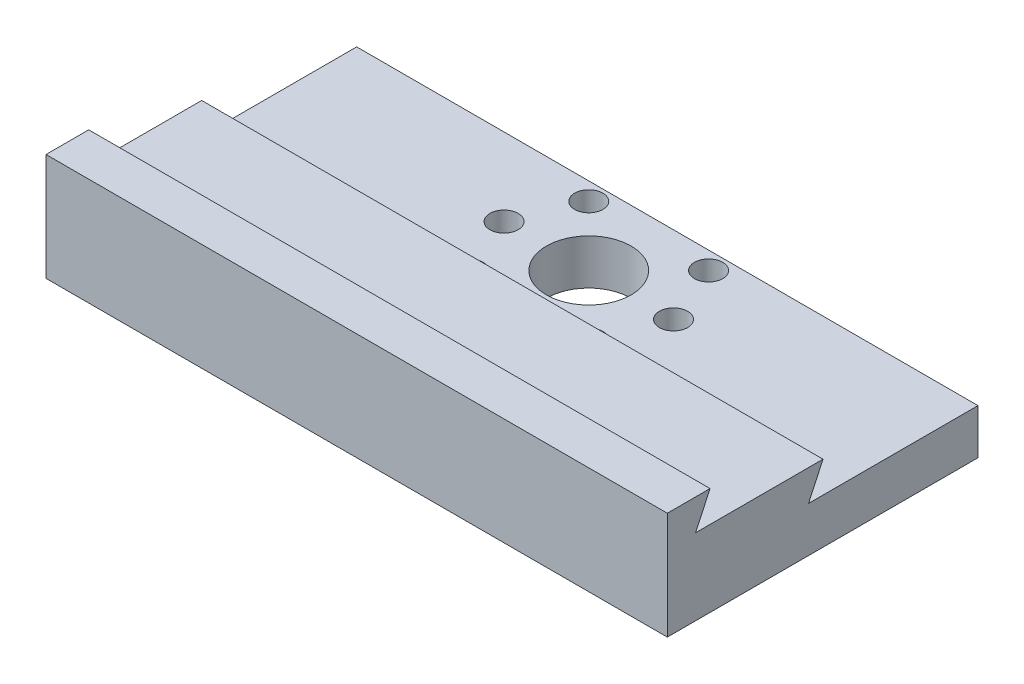
ISO-10303-21;
HEADER;
FILE_DESCRIPTION(('STEP AP214'),'2;1');
FILE_NAME('part.step','',(''),(''),'','','');
FILE_SCHEMA(('AUTOMOTIVE_DESIGN { 1 0 10303 214 1 1 1 1 }'));
ENDSEC;
DATA;
#1=APPLICATION_CONTEXT('core data for automotive mechanical design processes');
#2=APPLICATION_PROTOCOL_DEFINITION('international standard','automotive_design',2000,#1);
#3=PRODUCT_CONTEXT('',#1,'mechanical');
#4=PRODUCT('Part','Part','',(#3));
#5=PRODUCT_RELATED_PRODUCT_CATEGORY('part','',(#4));
#6=PRODUCT_DEFINITION_FORMATION('','',#4);
#7=PRODUCT_DEFINITION_CONTEXT('part definition',#1,'design');
#8=PRODUCT_DEFINITION('design','',#6,#7);
#9=PRODUCT_DEFINITION_SHAPE('','',#8);
#10=(LENGTH_UNIT() NAMED_UNIT(*) SI_UNIT(.MILLI.,.METRE.));
#11=(NAMED_UNIT(*) PLANE_ANGLE_UNIT() SI_UNIT($,.RADIAN.));
#12=(NAMED_UNIT(*) SI_UNIT($,.STERADIAN.) SOLID_ANGLE_UNIT());
#13=UNCERTAINTY_MEASURE_WITH_UNIT(LENGTH_MEASURE(1.E-05),#10,'distance_accuracy_value','');
#14=(GEOMETRIC_REPRESENTATION_CONTEXT(3) GLOBAL_UNCERTAINTY_ASSIGNED_CONTEXT((#13)) GLOBAL_UNIT_ASSIGNED_CONTEXT((#10,
#11,#12)) REPRESENTATION_CONTEXT('',''));
#15=CARTESIAN_POINT('',(0.,0.,0.));
#16=DIRECTION('',(0.,0.,1.));
#17=DIRECTION('',(1.,0.,0.));
#18=AXIS2_PLACEMENT_3D('',#15,#16,#17);
#19=CARTESIAN_POINT('',(110.,0.,-55.));
#20=DIRECTION('',(0.,1.,0.));
#21=DIRECTION('',(0.,0.,1.));
#22=AXIS2_PLACEMENT_3D('',#19,#20,#21);
#23=PLANE('',#22);
#24=CARTESIAN_POINT('',(44.2229672298513,0.,-51.8668942977481));
#25=DIRECTION('',(0.,1.,0.));
#26=DIRECTION('',(0.,0.,1.));
#27=AXIS2_PLACEMENT_3D('',#24,#25,#26);
#28=CIRCLE('',#27,2.50495838378975);
#29=CARTESIAN_POINT('',(44.2229672298513,0.,-49.3619359139584));
#30=VERTEX_POINT('',#29);
#31=EDGE_CURVE('E210',#30,#30,#28,.T.);
#32=ORIENTED_EDGE('',*,*,#31,.T.);
#33=EDGE_LOOP('',(#32));
#34=FACE_BOUND('',#33,.T.);
#35=CARTESIAN_POINT('',(65.4361706654477,0.,-51.8668942977483));
#36=DIRECTION('',(0.,1.,0.));
#37=DIRECTION('',(0.,0.,1.));
#38=AXIS2_PLACEMENT_3D('',#35,#36,#37);
#39=CIRCLE('',#38,2.50495838378975);
#40=CARTESIAN_POINT('',(65.4361706654477,0.,-49.3619359139586));
#41=VERTEX_POINT('',#40);
#42=EDGE_CURVE('E213',#41,#41,#39,.T.);
#43=ORIENTED_EDGE('',*,*,#42,.T.);
#44=EDGE_LOOP('',(#43));
#45=FACE_BOUND('',#44,.T.);
#46=CARTESIAN_POINT('',(69.8295689476496,0.,-41.26029257995));
#47=DIRECTION('',(0.,1.,0.));
#48=DIRECTION('',(0.,0.,1.));
#49=AXIS2_PLACEMENT_3D('',#46,#47,#48);
#50=CIRCLE('',#49,2.50495838378975);
#51=CARTESIAN_POINT('',(69.8295689476496,0.,-38.7553341961603));
#52=VERTEX_POINT('',#51);
#53=EDGE_CURVE('E216',#52,#52,#50,.T.);
#54=ORIENTED_EDGE('',*,*,#53,.T.);
#55=EDGE_LOOP('',(#54));
#56=FACE_BOUND('',#55,.T.);
#57=CARTESIAN_POINT('',(65.4361706654479,0.,-30.6536908621519));
#58=DIRECTION('',(0.,1.,0.));
#59=DIRECTION('',(0.,0.,1.));
#60=AXIS2_PLACEMENT_3D('',#57,#58,#59);
#61=CIRCLE('',#60,2.50495838378975);
#62=CARTESIAN_POINT('',(65.4361706654479,0.,-28.1487324783621));
#63=VERTEX_POINT('',#62);
#64=EDGE_CURVE('E219',#63,#63,#61,.T.);
#65=ORIENTED_EDGE('',*,*,#64,.T.);
#66=EDGE_LOOP('',(#65));
#67=FACE_BOUND('',#66,.T.);
#68=CARTESIAN_POINT('',(44.2229672298514,0.,-30.6536908621518));
#69=DIRECTION('',(0.,1.,0.));
#70=DIRECTION('',(0.,0.,1.));
#71=AXIS2_PLACEMENT_3D('',#68,#69,#70);
#72=CIRCLE('',#71,2.50495838378975);
#73=CARTESIAN_POINT('',(44.2229672298514,0.,-28.1487324783621));
#74=VERTEX_POINT('',#73);
#75=EDGE_CURVE('E222',#74,#74,#72,.T.);
#76=ORIENTED_EDGE('',*,*,#75,.T.);
#77=EDGE_LOOP('',(#76));
#78=FACE_BOUND('',#77,.T.);
#79=CARTESIAN_POINT('',(39.8295689476496,0.,-41.26029257995));
#80=DIRECTION('',(0.,1.,0.));
#81=DIRECTION('',(0.,0.,1.));
#82=AXIS2_PLACEMENT_3D('',#79,#80,#81);
#83=CIRCLE('',#82,2.50495838378975);
#84=CARTESIAN_POINT('',(39.8295689476496,0.,-38.7553341961603));
#85=VERTEX_POINT('',#84);
#86=EDGE_CURVE('E204',#85,#85,#83,.T.);
#87=ORIENTED_EDGE('',*,*,#86,.T.);
#88=EDGE_LOOP('',(#87));
#89=FACE_BOUND('',#88,.T.);
#90=CARTESIAN_POINT('',(54.8295689476496,0.,-41.26029257995));
#91=DIRECTION('',(0.,1.,0.));
#92=DIRECTION('',(0.,0.,1.));
#93=AXIS2_PLACEMENT_3D('',#90,#91,#92);
#94=CIRCLE('',#93,7.5);
#95=CARTESIAN_POINT('',(54.8295689476496,0.,-33.76029257995));
#96=VERTEX_POINT('',#95);
#97=EDGE_CURVE('E191',#96,#96,#94,.T.);
#98=ORIENTED_EDGE('',*,*,#97,.T.);
#99=EDGE_LOOP('',(#98));
#100=FACE_BOUND('',#99,.T.);
#101=DIRECTION('',(0.,0.,-1.));
#102=VECTOR('',#101,1.);
#103=CARTESIAN_POINT('',(0.,0.,-55.));
#104=LINE('',#103,#102);
#105=CARTESIAN_POINT('',(0.,0.,0.));
#106=VERTEX_POINT('',#105);
#107=CARTESIAN_POINT('',(0.,0.,-55.));
#108=VERTEX_POINT('',#107);
#109=EDGE_CURVE('E139',#106,#108,#104,.T.);
#110=ORIENTED_EDGE('',*,*,#109,.T.);
#111=DIRECTION('',(-1.,0.,0.));
#112=VECTOR('',#111,1.);
#113=CARTESIAN_POINT('',(110.,0.,-55.));
#114=LINE('',#113,#112);
#115=CARTESIAN_POINT('',(110.,0.,-55.));
#116=VERTEX_POINT('',#115);
#117=EDGE_CURVE('E11',#116,#108,#114,.T.);
#118=ORIENTED_EDGE('',*,*,#117,.F.);
#119=DIRECTION('',(0.,0.,-1.));
#120=VECTOR('',#119,1.);
#121=CARTESIAN_POINT('',(110.,0.,-55.));
#122=LINE('',#121,#120);
#123=CARTESIAN_POINT('',(110.,0.,0.));
#124=VERTEX_POINT('',#123);
#125=EDGE_CURVE('E154',#124,#116,#122,.T.);
#126=ORIENTED_EDGE('',*,*,#125,.F.);
#127=DIRECTION('',(-1.,0.,0.));
#128=VECTOR('',#127,1.);
#129=CARTESIAN_POINT('',(110.,0.,0.));
#130=LINE('',#129,#128);
#131=EDGE_CURVE('E135',#124,#106,#130,.T.);
#132=ORIENTED_EDGE('',*,*,#131,.T.);
#133=EDGE_LOOP('',(#110,#118,#126,#132));
#134=FACE_BOUND('',#133,.T.);
#135=ADVANCED_FACE('F43',(#34,#45,#56,#67,#78,#89,#100,#134),#23,.F.);
#136=CARTESIAN_POINT('',(110.,8.00000000000002,-55.));
#137=DIRECTION('',(0.,0.,1.));
#138=DIRECTION('',(1.,0.,0.));
#139=AXIS2_PLACEMENT_3D('',#136,#137,#138);
#140=PLANE('',#139);
#141=CARTESIAN_POINT('',(20.9488303410143,4.50000000000001,-55.));
#142=DIRECTION('',(0.,0.,-1.));
#143=DIRECTION('',(-1.,0.,0.));
#144=AXIS2_PLACEMENT_3D('',#141,#142,#143);
#145=CIRCLE('',#144,2.);
#146=CARTESIAN_POINT('',(18.9488303410143,4.50000000000001,-55.));
#147=VERTEX_POINT('',#146);
#148=EDGE_CURVE('E194',#147,#147,#145,.T.);
#149=ORIENTED_EDGE('',*,*,#148,.F.);
#150=EDGE_LOOP('',(#149));
#151=FACE_BOUND('',#150,.T.);
#152=CARTESIAN_POINT('',(89.0511696589857,4.50000000000001,-55.));
#153=DIRECTION('',(0.,0.,-1.));
#154=DIRECTION('',(1.,0.,0.));
#155=AXIS2_PLACEMENT_3D('',#152,#153,#154);
#156=CIRCLE('',#155,2.);
#157=CARTESIAN_POINT('',(91.0511696589857,4.50000000000001,-55.));
#158=VERTEX_POINT('',#157);
#159=EDGE_CURVE('E187',#158,#158,#156,.T.);
#160=ORIENTED_EDGE('',*,*,#159,.F.);
#161=EDGE_LOOP('',(#160));
#162=FACE_BOUND('',#161,.T.);
#163=DIRECTION('',(0.,1.,0.));
#164=VECTOR('',#163,1.);
#165=CARTESIAN_POINT('',(0.,8.00000000000002,-55.));
#166=LINE('',#165,#164);
#167=CARTESIAN_POINT('',(0.,8.00000000000002,-55.));
#168=VERTEX_POINT('',#167);
#169=EDGE_CURVE('E142',#108,#168,#166,.T.);
#170=ORIENTED_EDGE('',*,*,#169,.T.);
#171=DIRECTION('',(-1.,0.,0.));
#172=VECTOR('',#171,1.);
#173=CARTESIAN_POINT('',(110.,8.00000000000002,-55.));
#174=LINE('',#173,#172);
#175=CARTESIAN_POINT('',(110.,8.00000000000002,-55.));
#176=VERTEX_POINT('',#175);
#177=EDGE_CURVE('E51',#176,#168,#174,.T.);
#178=ORIENTED_EDGE('',*,*,#177,.F.);
#179=DIRECTION('',(0.,1.,0.));
#180=VECTOR('',#179,1.);
#181=CARTESIAN_POINT('',(110.,8.00000000000002,-55.));
#182=LINE('',#181,#180);
#183=EDGE_CURVE('E102',#116,#176,#182,.T.);
#184=ORIENTED_EDGE('',*,*,#183,.F.);
#185=ORIENTED_EDGE('',*,*,#117,.T.);
#186=EDGE_LOOP('',(#170,#178,#184,#185));
#187=FACE_BOUND('',#186,.T.);
#188=ADVANCED_FACE('F246',(#151,#162,#187),#140,.F.);
#189=CARTESIAN_POINT('',(110.,8.00000000000001,-25.));
#190=DIRECTION('',(0.,-1.,0.));
#191=DIRECTION('',(0.,0.,-1.));
#192=AXIS2_PLACEMENT_3D('',#189,#190,#191);
#193=PLANE('',#192);
#194=CARTESIAN_POINT('',(44.2229672298513,8.00000000000001,-51.8668942977481));
#195=DIRECTION('',(0.,1.,0.));
#196=DIRECTION('',(-0.707106781186539,0.,0.707106781186556));
#197=AXIS2_PLACEMENT_3D('',#194,#195,#196);
#198=CIRCLE('',#197,2.50495838378975);
#199=CARTESIAN_POINT('',(42.4516941700835,8.00000000000001,-50.0956212379803));
#200=VERTEX_POINT('',#199);
#201=EDGE_CURVE('E229',#200,#200,#198,.T.);
#202=ORIENTED_EDGE('',*,*,#201,.F.);
#203=EDGE_LOOP('',(#202));
#204=FACE_BOUND('',#203,.T.);
#205=CARTESIAN_POINT('',(65.4361706654477,8.00000000000001,-51.8668942977483));
#206=DIRECTION('',(0.,1.,0.));
#207=DIRECTION('',(-0.707106781186554,0.,-0.707106781186541));
#208=AXIS2_PLACEMENT_3D('',#205,#206,#207);
#209=CIRCLE('',#208,2.50495838378975);
#210=CARTESIAN_POINT('',(63.6648976056799,8.00000000000001,-53.6381673575161));
#211=VERTEX_POINT('',#210);
#212=EDGE_CURVE('E232',#211,#211,#209,.T.);
#213=ORIENTED_EDGE('',*,*,#212,.F.);
#214=EDGE_LOOP('',(#213));
#215=FACE_BOUND('',#214,.T.);
#216=CARTESIAN_POINT('',(69.8295689476496,8.00000000000001,-41.26029257995));
#217=DIRECTION('',(0.,1.,0.));
#218=DIRECTION('',(0.,0.,-1.));
#219=AXIS2_PLACEMENT_3D('',#216,#217,#218);
#220=CIRCLE('',#219,2.50495838378975);
#221=CARTESIAN_POINT('',(69.8295689476496,8.00000000000001,-43.7652509637398));
#222=VERTEX_POINT('',#221);
#223=EDGE_CURVE('E235',#222,#222,#220,.T.);
#224=ORIENTED_EDGE('',*,*,#223,.F.);
#225=EDGE_LOOP('',(#224));
#226=FACE_BOUND('',#225,.T.);
#227=CARTESIAN_POINT('',(65.4361706654479,8.00000000000001,-30.6536908621519));
#228=DIRECTION('',(0.,1.,0.));
#229=DIRECTION('',(0.707106781186544,0.,-0.707106781186551));
#230=AXIS2_PLACEMENT_3D('',#227,#228,#229);
#231=CIRCLE('',#230,2.50495838378975);
#232=CARTESIAN_POINT('',(67.2074437252157,8.00000000000001,-32.4249639219197));
#233=VERTEX_POINT('',#232);
#234=EDGE_CURVE('E228',#233,#233,#231,.T.);
#235=ORIENTED_EDGE('',*,*,#234,.F.);
#236=EDGE_LOOP('',(#235));
#237=FACE_BOUND('',#236,.T.);
#238=CARTESIAN_POINT('',(44.2229672298514,8.00000000000001,-30.6536908621518));
#239=DIRECTION('',(0.,1.,0.));
#240=DIRECTION('',(0.707106781186549,0.,0.707106781186546));
#241=AXIS2_PLACEMENT_3D('',#238,#239,#240);
#242=CIRCLE('',#241,2.50495838378975);
#243=CARTESIAN_POINT('',(45.9942402896193,8.00000000000001,-28.882417802384));
#244=VERTEX_POINT('',#243);
#245=EDGE_CURVE('E225',#244,#244,#242,.T.);
#246=ORIENTED_EDGE('',*,*,#245,.F.);
#247=EDGE_LOOP('',(#246));
#248=FACE_BOUND('',#247,.T.);
#249=CARTESIAN_POINT('',(39.8295689476496,8.00000000000001,-41.26029257995));
#250=DIRECTION('',(0.,1.,0.));
#251=DIRECTION('',(0.,0.,1.));
#252=AXIS2_PLACEMENT_3D('',#249,#250,#251);
#253=CIRCLE('',#252,2.50495838378975);
#254=CARTESIAN_POINT('',(39.8295689476496,8.00000000000001,-38.7553341961603));
#255=VERTEX_POINT('',#254);
#256=EDGE_CURVE('E207',#255,#255,#253,.T.);
#257=ORIENTED_EDGE('',*,*,#256,.F.);
#258=EDGE_LOOP('',(#257));
#259=FACE_BOUND('',#258,.T.);
#260=CARTESIAN_POINT('',(54.8295689476496,8.00000000000001,-41.26029257995));
#261=DIRECTION('',(0.,1.,0.));
#262=DIRECTION('',(0.,0.,1.));
#263=AXIS2_PLACEMENT_3D('',#260,#261,#262);
#264=CIRCLE('',#263,7.5);
#265=CARTESIAN_POINT('',(54.8295689476496,8.00000000000001,-33.76029257995));
#266=VERTEX_POINT('',#265);
#267=EDGE_CURVE('E201',#266,#266,#264,.T.);
#268=ORIENTED_EDGE('',*,*,#267,.F.);
#269=EDGE_LOOP('',(#268));
#270=FACE_BOUND('',#269,.T.);
#271=DIRECTION('',(0.,0.,1.));
#272=VECTOR('',#271,1.);
#273=CARTESIAN_POINT('',(0.,8.00000000000001,-25.));
#274=LINE('',#273,#272);
#275=CARTESIAN_POINT('',(0.,8.00000000000001,-25.));
#276=VERTEX_POINT('',#275);
#277=EDGE_CURVE('E145',#168,#276,#274,.T.);
#278=ORIENTED_EDGE('',*,*,#277,.T.);
#279=DIRECTION('',(-1.,0.,0.));
#280=VECTOR('',#279,1.);
#281=CARTESIAN_POINT('',(110.,8.00000000000001,-25.));
#282=LINE('',#281,#280);
#283=CARTESIAN_POINT('',(110.,8.00000000000001,-25.));
#284=VERTEX_POINT('',#283);
#285=EDGE_CURVE('E161',#284,#276,#282,.T.);
#286=ORIENTED_EDGE('',*,*,#285,.F.);
#287=DIRECTION('',(0.,0.,1.));
#288=VECTOR('',#287,1.);
#289=CARTESIAN_POINT('',(110.,8.00000000000001,-25.));
#290=LINE('',#289,#288);
#291=EDGE_CURVE('E169',#176,#284,#290,.T.);
#292=ORIENTED_EDGE('',*,*,#291,.F.);
#293=ORIENTED_EDGE('',*,*,#177,.T.);
#294=EDGE_LOOP('',(#278,#286,#292,#293));
#295=FACE_BOUND('',#294,.T.);
#296=ADVANCED_FACE('F167',(#204,#215,#226,#237,#248,#259,#270,#295),#193,.F.);
#297=CARTESIAN_POINT('',(110.,13.5,-27.5646921198525));
#298=DIRECTION('',(0.,0.422618261740704,0.906307787036648));
#299=DIRECTION('',(0.,-0.906307787036648,0.422618261740704));
#300=AXIS2_PLACEMENT_3D('',#297,#298,#299);
#301=PLANE('',#300);
#302=DIRECTION('',(0.,0.906307787036648,-0.422618261740704));
#303=VECTOR('',#302,1.);
#304=CARTESIAN_POINT('',(0.,13.5,-27.5646921198525));
#305=LINE('',#304,#303);
#306=CARTESIAN_POINT('',(0.,13.5,-27.5646921198525));
#307=VERTEX_POINT('',#306);
#308=EDGE_CURVE('E147',#276,#307,#305,.T.);
#309=ORIENTED_EDGE('',*,*,#308,.T.);
#310=DIRECTION('',(-1.,0.,0.));
#311=VECTOR('',#310,1.);
#312=CARTESIAN_POINT('',(110.,13.5,-27.5646921198525));
#313=LINE('',#312,#311);
#314=CARTESIAN_POINT('',(110.,13.5,-27.5646921198525));
#315=VERTEX_POINT('',#314);
#316=EDGE_CURVE('E158',#315,#307,#313,.T.);
#317=ORIENTED_EDGE('',*,*,#316,.F.);
#318=DIRECTION('',(0.,0.906307787036648,-0.422618261740704));
#319=VECTOR('',#318,1.);
#320=CARTESIAN_POINT('',(110.,13.5,-27.5646921198525));
#321=LINE('',#320,#319);
#322=EDGE_CURVE('E181',#284,#315,#321,.T.);
#323=ORIENTED_EDGE('',*,*,#322,.F.);
#324=ORIENTED_EDGE('',*,*,#285,.T.);
#325=EDGE_LOOP('',(#309,#317,#323,#324));
#326=FACE_BOUND('',#325,.T.);
#327=ADVANCED_FACE('F177',(#326),#301,.F.);
#328=CARTESIAN_POINT('',(110.,13.5,-5.));
#329=DIRECTION('',(0.,-1.,0.));
#330=DIRECTION('',(0.,0.,-1.));
#331=AXIS2_PLACEMENT_3D('',#328,#329,#330);
#332=PLANE('',#331);
#333=DIRECTION('',(0.,0.,1.));
#334=VECTOR('',#333,1.);
#335=CARTESIAN_POINT('',(0.,13.5,-5.));
#336=LINE('',#335,#334);
#337=CARTESIAN_POINT('',(0.,13.5,-5.));
#338=VERTEX_POINT('',#337);
#339=EDGE_CURVE('E149',#307,#338,#336,.T.);
#340=ORIENTED_EDGE('',*,*,#339,.T.);
#341=DIRECTION('',(-1.,0.,0.));
#342=VECTOR('',#341,1.);
#343=CARTESIAN_POINT('',(110.,13.5,-5.));
#344=LINE('',#343,#342);
#345=CARTESIAN_POINT('',(110.,13.5,-5.));
#346=VERTEX_POINT('',#345);
#347=EDGE_CURVE('E130',#346,#338,#344,.T.);
#348=ORIENTED_EDGE('',*,*,#347,.F.);
#349=DIRECTION('',(0.,0.,1.));
#350=VECTOR('',#349,1.);
#351=CARTESIAN_POINT('',(110.,13.5,-5.));
#352=LINE('',#351,#350);
#353=EDGE_CURVE('E121',#315,#346,#352,.T.);
#354=ORIENTED_EDGE('',*,*,#353,.F.);
#355=ORIENTED_EDGE('',*,*,#316,.T.);
#356=EDGE_LOOP('',(#340,#348,#354,#355));
#357=FACE_BOUND('',#356,.T.);
#358=ADVANCED_FACE('F180',(#357),#332,.F.);
#359=CARTESIAN_POINT('',(110.,19.,-7.56469211985252));
#360=DIRECTION('',(0.,0.422618261740704,0.906307787036648));
#361=DIRECTION('',(0.,-0.906307787036648,0.422618261740704));
#362=AXIS2_PLACEMENT_3D('',#359,#360,#361);
#363=PLANE('',#362);
#364=DIRECTION('',(0.,0.906307787036648,-0.422618261740704));
#365=VECTOR('',#364,1.);
#366=CARTESIAN_POINT('',(0.,19.,-7.56469211985252));
#367=LINE('',#366,#365);
#368=CARTESIAN_POINT('',(0.,19.,-7.56469211985252));
#369=VERTEX_POINT('',#368);
#370=EDGE_CURVE('E129',#338,#369,#367,.T.);
#371=ORIENTED_EDGE('',*,*,#370,.T.);
#372=DIRECTION('',(-1.,0.,0.));
#373=VECTOR('',#372,1.);
#374=CARTESIAN_POINT('',(110.,19.,-7.56469211985252));
#375=LINE('',#374,#373);
#376=CARTESIAN_POINT('',(110.,19.,-7.56469211985252));
#377=VERTEX_POINT('',#376);
#378=EDGE_CURVE('E126',#377,#369,#375,.T.);
#379=ORIENTED_EDGE('',*,*,#378,.F.);
#380=DIRECTION('',(0.,0.906307787036648,-0.422618261740704));
#381=VECTOR('',#380,1.);
#382=CARTESIAN_POINT('',(110.,19.,-7.56469211985252));
#383=LINE('',#382,#381);
#384=EDGE_CURVE('E115',#346,#377,#383,.T.);
#385=ORIENTED_EDGE('',*,*,#384,.F.);
#386=ORIENTED_EDGE('',*,*,#347,.T.);
#387=EDGE_LOOP('',(#371,#379,#385,#386));
#388=FACE_BOUND('',#387,.T.);
#389=ADVANCED_FACE('F127',(#388),#363,.F.);
#390=CARTESIAN_POINT('',(110.,19.,0.));
#391=DIRECTION('',(0.,-1.,0.));
#392=DIRECTION('',(0.,0.,-1.));
#393=AXIS2_PLACEMENT_3D('',#390,#391,#392);
#394=PLANE('',#393);
#395=DIRECTION('',(0.,0.,1.));
#396=VECTOR('',#395,1.);
#397=CARTESIAN_POINT('',(0.,19.,0.));
#398=LINE('',#397,#396);
#399=CARTESIAN_POINT('',(0.,19.,0.));
#400=VERTEX_POINT('',#399);
#401=EDGE_CURVE('E88',#369,#400,#398,.T.);
#402=ORIENTED_EDGE('',*,*,#401,.T.);
#403=DIRECTION('',(-1.,0.,0.));
#404=VECTOR('',#403,1.);
#405=CARTESIAN_POINT('',(110.,19.,0.));
#406=LINE('',#405,#404);
#407=CARTESIAN_POINT('',(110.,19.,0.));
#408=VERTEX_POINT('',#407);
#409=EDGE_CURVE('E131',#408,#400,#406,.T.);
#410=ORIENTED_EDGE('',*,*,#409,.F.);
#411=DIRECTION('',(0.,0.,1.));
#412=VECTOR('',#411,1.);
#413=CARTESIAN_POINT('',(110.,19.,0.));
#414=LINE('',#413,#412);
#415=EDGE_CURVE('E119',#377,#408,#414,.T.);
#416=ORIENTED_EDGE('',*,*,#415,.F.);
#417=ORIENTED_EDGE('',*,*,#378,.T.);
#418=EDGE_LOOP('',(#402,#410,#416,#417));
#419=FACE_BOUND('',#418,.T.);
#420=ADVANCED_FACE('F133',(#419),#394,.F.);
#421=CARTESIAN_POINT('',(110.,0.,0.));
#422=DIRECTION('',(0.,0.,-1.));
#423=DIRECTION('',(-1.,0.,0.));
#424=AXIS2_PLACEMENT_3D('',#421,#422,#423);
#425=PLANE('',#424);
#426=DIRECTION('',(0.,-1.,0.));
#427=VECTOR('',#426,1.);
#428=CARTESIAN_POINT('',(0.,0.,0.));
#429=LINE('',#428,#427);
#430=EDGE_CURVE('E94',#400,#106,#429,.T.);
#431=ORIENTED_EDGE('',*,*,#430,.T.);
#432=ORIENTED_EDGE('',*,*,#131,.F.);
#433=DIRECTION('',(0.,-1.,0.));
#434=VECTOR('',#433,1.);
#435=CARTESIAN_POINT('',(110.,0.,0.));
#436=LINE('',#435,#434);
#437=EDGE_CURVE('E59',#408,#124,#436,.T.);
#438=ORIENTED_EDGE('',*,*,#437,.F.);
#439=ORIENTED_EDGE('',*,*,#409,.T.);
#440=EDGE_LOOP('',(#431,#432,#438,#439));
#441=FACE_BOUND('',#440,.T.);
#442=ADVANCED_FACE('F268',(#441),#425,.F.);
#443=CARTESIAN_POINT('',(110.,0.,0.));
#444=DIRECTION('',(-1.,0.,0.));
#445=DIRECTION('',(0.,0.,1.));
#446=AXIS2_PLACEMENT_3D('',#443,#444,#445);
#447=PLANE('',#446);
#448=ORIENTED_EDGE('',*,*,#125,.T.);
#449=ORIENTED_EDGE('',*,*,#183,.T.);
#450=ORIENTED_EDGE('',*,*,#291,.T.);
#451=ORIENTED_EDGE('',*,*,#322,.T.);
#452=ORIENTED_EDGE('',*,*,#353,.T.);
#453=ORIENTED_EDGE('',*,*,#384,.T.);
#454=ORIENTED_EDGE('',*,*,#415,.T.);
#455=ORIENTED_EDGE('',*,*,#437,.T.);
#456=EDGE_LOOP('',(#448,#449,#450,#451,#452,#453,#454,#455));
#457=FACE_BOUND('',#456,.T.);
#458=ADVANCED_FACE('F117',(#457),#447,.F.);
#459=CARTESIAN_POINT('',(0.,0.,0.));
#460=DIRECTION('',(-1.,0.,0.));
#461=DIRECTION('',(0.,0.,1.));
#462=AXIS2_PLACEMENT_3D('',#459,#460,#461);
#463=PLANE('',#462);
#464=ORIENTED_EDGE('',*,*,#109,.F.);
#465=ORIENTED_EDGE('',*,*,#430,.F.);
#466=ORIENTED_EDGE('',*,*,#401,.F.);
#467=ORIENTED_EDGE('',*,*,#370,.F.);
#468=ORIENTED_EDGE('',*,*,#339,.F.);
#469=ORIENTED_EDGE('',*,*,#308,.F.);
#470=ORIENTED_EDGE('',*,*,#277,.F.);
#471=ORIENTED_EDGE('',*,*,#169,.F.);
#472=EDGE_LOOP('',(#464,#465,#466,#467,#468,#469,#470,#471));
#473=FACE_BOUND('',#472,.T.);
#474=ADVANCED_FACE('F173',(#473),#463,.T.);
#475=CARTESIAN_POINT('',(89.0511696589857,4.50000000000001,-35.));
#476=DIRECTION('',(0.,0.,-1.));
#477=DIRECTION('',(-1.,0.,0.));
#478=AXIS2_PLACEMENT_3D('',#475,#476,#477);
#479=CYLINDRICAL_SURFACE('',#478,2.);
#480=CARTESIAN_POINT('',(89.0511696589857,4.50000000000001,-35.));
#481=DIRECTION('',(0.,0.,-1.));
#482=DIRECTION('',(1.,0.,0.));
#483=AXIS2_PLACEMENT_3D('',#480,#481,#482);
#484=CIRCLE('',#483,2.);
#485=CARTESIAN_POINT('',(91.0511696589857,4.50000000000001,-35.));
#486=VERTEX_POINT('',#485);
#487=EDGE_CURVE('E190',#486,#486,#484,.T.);
#488=ORIENTED_EDGE('',*,*,#487,.F.);
#489=EDGE_LOOP('',(#488));
#490=FACE_BOUND('',#489,.T.);
#491=ORIENTED_EDGE('',*,*,#159,.T.);
#492=EDGE_LOOP('',(#491));
#493=FACE_BOUND('',#492,.T.);
#494=ADVANCED_FACE('F294',(#490,#493),#479,.F.);
#495=CARTESIAN_POINT('',(89.0511696589857,4.50000000000001,-35.));
#496=DIRECTION('',(0.,0.,1.));
#497=DIRECTION('',(1.,0.,0.));
#498=AXIS2_PLACEMENT_3D('',#495,#496,#497);
#499=PLANE('',#498);
#500=ORIENTED_EDGE('',*,*,#487,.T.);
#501=EDGE_LOOP('',(#500));
#502=FACE_BOUND('',#501,.T.);
#503=ADVANCED_FACE('F295',(#502),#499,.F.);
#504=CARTESIAN_POINT('',(20.9488303410143,4.50000000000001,-35.));
#505=DIRECTION('',(0.,0.,-1.));
#506=DIRECTION('',(-1.,0.,0.));
#507=AXIS2_PLACEMENT_3D('',#504,#505,#506);
#508=CYLINDRICAL_SURFACE('',#507,2.);
#509=CARTESIAN_POINT('',(20.9488303410143,4.50000000000001,-35.));
#510=DIRECTION('',(0.,0.,-1.));
#511=DIRECTION('',(-1.,0.,0.));
#512=AXIS2_PLACEMENT_3D('',#509,#510,#511);
#513=CIRCLE('',#512,2.);
#514=CARTESIAN_POINT('',(18.9488303410143,4.50000000000001,-35.));
#515=VERTEX_POINT('',#514);
#516=EDGE_CURVE('E143',#515,#515,#513,.T.);
#517=ORIENTED_EDGE('',*,*,#516,.F.);
#518=EDGE_LOOP('',(#517));
#519=FACE_BOUND('',#518,.T.);
#520=ORIENTED_EDGE('',*,*,#148,.T.);
#521=EDGE_LOOP('',(#520));
#522=FACE_BOUND('',#521,.T.);
#523=ADVANCED_FACE('F301',(#519,#522),#508,.F.);
#524=CARTESIAN_POINT('',(20.9488303410143,4.50000000000001,-35.));
#525=DIRECTION('',(0.,0.,-1.));
#526=DIRECTION('',(-1.,0.,0.));
#527=AXIS2_PLACEMENT_3D('',#524,#525,#526);
#528=PLANE('',#527);
#529=ORIENTED_EDGE('',*,*,#516,.T.);
#530=EDGE_LOOP('',(#529));
#531=FACE_BOUND('',#530,.T.);
#532=ADVANCED_FACE('F259',(#531),#528,.T.);
#533=CARTESIAN_POINT('',(54.8295689476496,-1.99999999999999,-41.26029257995));
#534=DIRECTION('',(0.,1.,0.));
#535=DIRECTION('',(0.,0.,1.));
#536=AXIS2_PLACEMENT_3D('',#533,#534,#535);
#537=CYLINDRICAL_SURFACE('',#536,7.5);
#538=ORIENTED_EDGE('',*,*,#267,.T.);
#539=EDGE_LOOP('',(#538));
#540=FACE_BOUND('',#539,.T.);
#541=ORIENTED_EDGE('',*,*,#97,.F.);
#542=EDGE_LOOP('',(#541));
#543=FACE_BOUND('',#542,.T.);
#544=ADVANCED_FACE('F255',(#540,#543),#537,.F.);
#545=CARTESIAN_POINT('',(39.8295689476496,-1.99999999999999,-41.26029257995));
#546=DIRECTION('',(0.,1.,0.));
#547=DIRECTION('',(0.,0.,1.));
#548=AXIS2_PLACEMENT_3D('',#545,#546,#547);
#549=CYLINDRICAL_SURFACE('',#548,2.50495838378975);
#550=ORIENTED_EDGE('',*,*,#256,.T.);
#551=EDGE_LOOP('',(#550));
#552=FACE_BOUND('',#551,.T.);
#553=ORIENTED_EDGE('',*,*,#86,.F.);
#554=EDGE_LOOP('',(#553));
#555=FACE_BOUND('',#554,.T.);
#556=ADVANCED_FACE('F258',(#552,#555),#549,.F.);
#557=CARTESIAN_POINT('',(44.2229672298514,-1.99999999999999,-30.6536908621518));
#558=DIRECTION('',(0.,1.,0.));
#559=DIRECTION('',(0.,0.,1.));
#560=AXIS2_PLACEMENT_3D('',#557,#558,#559);
#561=CYLINDRICAL_SURFACE('',#560,2.50495838378975);
#562=ORIENTED_EDGE('',*,*,#245,.T.);
#563=EDGE_LOOP('',(#562));
#564=FACE_BOUND('',#563,.T.);
#565=ORIENTED_EDGE('',*,*,#75,.F.);
#566=EDGE_LOOP('',(#565));
#567=FACE_BOUND('',#566,.T.);
#568=ADVANCED_FACE('F314',(#564,#567),#561,.F.);
#569=CARTESIAN_POINT('',(65.4361706654479,-1.99999999999999,-30.6536908621519));
#570=DIRECTION('',(0.,1.,0.));
#571=DIRECTION('',(0.,0.,1.));
#572=AXIS2_PLACEMENT_3D('',#569,#570,#571);
#573=CYLINDRICAL_SURFACE('',#572,2.50495838378975);
#574=ORIENTED_EDGE('',*,*,#234,.T.);
#575=EDGE_LOOP('',(#574));
#576=FACE_BOUND('',#575,.T.);
#577=ORIENTED_EDGE('',*,*,#64,.F.);
#578=EDGE_LOOP('',(#577));
#579=FACE_BOUND('',#578,.T.);
#580=ADVANCED_FACE('F241',(#576,#579),#573,.F.);
#581=CARTESIAN_POINT('',(69.8295689476496,-1.99999999999999,-41.26029257995));
#582=DIRECTION('',(0.,1.,0.));
#583=DIRECTION('',(0.,0.,1.));
#584=AXIS2_PLACEMENT_3D('',#581,#582,#583);
#585=CYLINDRICAL_SURFACE('',#584,2.50495838378975);
#586=ORIENTED_EDGE('',*,*,#223,.T.);
#587=EDGE_LOOP('',(#586));
#588=FACE_BOUND('',#587,.T.);
#589=ORIENTED_EDGE('',*,*,#53,.F.);
#590=EDGE_LOOP('',(#589));
#591=FACE_BOUND('',#590,.T.);
#592=ADVANCED_FACE('F326',(#588,#591),#585,.F.);
#593=CARTESIAN_POINT('',(65.4361706654477,-1.99999999999999,-51.8668942977483));
#594=DIRECTION('',(0.,1.,0.));
#595=DIRECTION('',(0.,0.,1.));
#596=AXIS2_PLACEMENT_3D('',#593,#594,#595);
#597=CYLINDRICAL_SURFACE('',#596,2.50495838378975);
#598=ORIENTED_EDGE('',*,*,#212,.T.);
#599=EDGE_LOOP('',(#598));
#600=FACE_BOUND('',#599,.T.);
#601=ORIENTED_EDGE('',*,*,#42,.F.);
#602=EDGE_LOOP('',(#601));
#603=FACE_BOUND('',#602,.T.);
#604=ADVANCED_FACE('F322',(#600,#603),#597,.F.);
#605=CARTESIAN_POINT('',(44.2229672298513,-1.99999999999999,-51.8668942977481));
#606=DIRECTION('',(0.,1.,0.));
#607=DIRECTION('',(0.,0.,1.));
#608=AXIS2_PLACEMENT_3D('',#605,#606,#607);
#609=CYLINDRICAL_SURFACE('',#608,2.50495838378975);
#610=ORIENTED_EDGE('',*,*,#201,.T.);
#611=EDGE_LOOP('',(#610));
#612=FACE_BOUND('',#611,.T.);
#613=ORIENTED_EDGE('',*,*,#31,.F.);
#614=EDGE_LOOP('',(#613));
#615=FACE_BOUND('',#614,.T.);
#616=ADVANCED_FACE('F319',(#612,#615),#609,.F.);
#617=CLOSED_SHELL('',(#135,#188,#296,#327,#358,#389,#420,#442,#458,#474,#494,#503,#523,#532,
#544,#556,#568,#580,#592,#604,#616));
#618=MANIFOLD_SOLID_BREP('B2',#617);
#619=ADVANCED_BREP_SHAPE_REPRESENTATION('',(#18,#618),#14);
#620=SHAPE_DEFINITION_REPRESENTATION(#9,#619);
ENDSEC;
END-ISO-10303-21;
